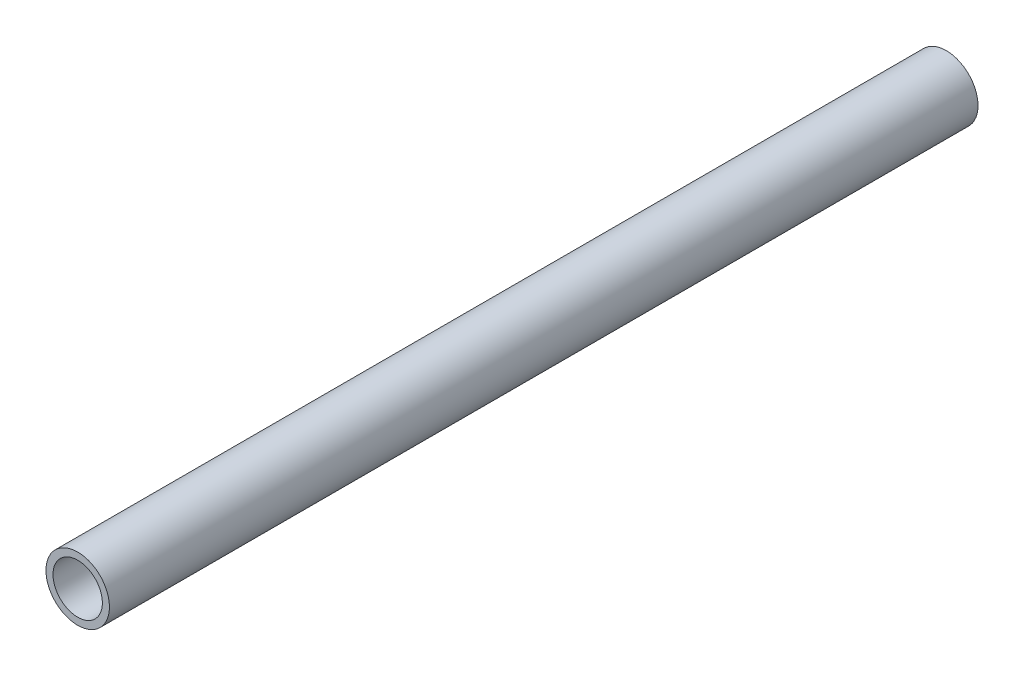
ISO-10303-21;
HEADER;
FILE_DESCRIPTION(('STEP AP214'),'2;1');
FILE_NAME('part.step','',(''),(''),'','','');
FILE_SCHEMA(('AUTOMOTIVE_DESIGN { 1 0 10303 214 1 1 1 1 }'));
ENDSEC;
DATA;
#1=APPLICATION_CONTEXT('core data for automotive mechanical design processes');
#2=APPLICATION_PROTOCOL_DEFINITION('international standard','automotive_design',2000,#1);
#3=PRODUCT_CONTEXT('',#1,'mechanical');
#4=PRODUCT('Part','Part','',(#3));
#5=PRODUCT_RELATED_PRODUCT_CATEGORY('part','',(#4));
#6=PRODUCT_DEFINITION_FORMATION('','',#4);
#7=PRODUCT_DEFINITION_CONTEXT('part definition',#1,'design');
#8=PRODUCT_DEFINITION('design','',#6,#7);
#9=PRODUCT_DEFINITION_SHAPE('','',#8);
#10=(LENGTH_UNIT() NAMED_UNIT(*) SI_UNIT(.MILLI.,.METRE.));
#11=(NAMED_UNIT(*) PLANE_ANGLE_UNIT() SI_UNIT($,.RADIAN.));
#12=(NAMED_UNIT(*) SI_UNIT($,.STERADIAN.) SOLID_ANGLE_UNIT());
#13=UNCERTAINTY_MEASURE_WITH_UNIT(LENGTH_MEASURE(1.E-05),#10,'distance_accuracy_value','');
#14=(GEOMETRIC_REPRESENTATION_CONTEXT(3) GLOBAL_UNCERTAINTY_ASSIGNED_CONTEXT((#13)) GLOBAL_UNIT_ASSIGNED_CONTEXT((#10,
#11,#12)) REPRESENTATION_CONTEXT('',''));
#15=CARTESIAN_POINT('',(0.,0.,0.));
#16=DIRECTION('',(0.,0.,1.));
#17=DIRECTION('',(1.,0.,0.));
#18=AXIS2_PLACEMENT_3D('',#15,#16,#17);
#19=CARTESIAN_POINT('',(0.,0.,246.188));
#20=DIRECTION('',(0.,0.,1.));
#21=DIRECTION('',(1.,0.,0.));
#22=AXIS2_PLACEMENT_3D('',#19,#20,#21);
#23=PLANE('',#22);
#24=CARTESIAN_POINT('',(0.,0.,246.188));
#25=DIRECTION('',(0.,0.,1.));
#26=DIRECTION('',(1.,0.,0.));
#27=AXIS2_PLACEMENT_3D('',#24,#25,#26);
#28=CIRCLE('',#27,9.);
#29=CARTESIAN_POINT('',(9.,0.,246.188));
#30=VERTEX_POINT('',#29);
#31=EDGE_CURVE('E10',#30,#30,#28,.T.);
#32=ORIENTED_EDGE('',*,*,#31,.T.);
#33=EDGE_LOOP('',(#32));
#34=FACE_BOUND('',#33,.T.);
#35=CARTESIAN_POINT('',(0.,0.,246.188));
#36=DIRECTION('',(0.,0.,1.));
#37=DIRECTION('',(1.,0.,0.));
#38=AXIS2_PLACEMENT_3D('',#35,#36,#37);
#39=CIRCLE('',#38,7.);
#40=CARTESIAN_POINT('',(7.,0.,246.188));
#41=VERTEX_POINT('',#40);
#42=EDGE_CURVE('E41',#41,#41,#39,.T.);
#43=ORIENTED_EDGE('',*,*,#42,.F.);
#44=EDGE_LOOP('',(#43));
#45=FACE_BOUND('',#44,.T.);
#46=ADVANCED_FACE('F30',(#34,#45),#23,.T.);
#47=CARTESIAN_POINT('',(0.,0.,0.));
#48=DIRECTION('',(0.,0.,1.));
#49=DIRECTION('',(1.,0.,0.));
#50=AXIS2_PLACEMENT_3D('',#47,#48,#49);
#51=PLANE('',#50);
#52=CARTESIAN_POINT('',(0.,0.,0.));
#53=DIRECTION('',(0.,0.,1.));
#54=DIRECTION('',(1.,0.,0.));
#55=AXIS2_PLACEMENT_3D('',#52,#53,#54);
#56=CIRCLE('',#55,9.);
#57=CARTESIAN_POINT('',(9.,0.,0.));
#58=VERTEX_POINT('',#57);
#59=EDGE_CURVE('E34',#58,#58,#56,.T.);
#60=ORIENTED_EDGE('',*,*,#59,.F.);
#61=EDGE_LOOP('',(#60));
#62=FACE_BOUND('',#61,.T.);
#63=CARTESIAN_POINT('',(0.,0.,0.));
#64=DIRECTION('',(0.,0.,1.));
#65=DIRECTION('',(1.,0.,0.));
#66=AXIS2_PLACEMENT_3D('',#63,#64,#65);
#67=CIRCLE('',#66,7.);
#68=CARTESIAN_POINT('',(7.,0.,0.));
#69=VERTEX_POINT('',#68);
#70=EDGE_CURVE('E43',#69,#69,#67,.T.);
#71=ORIENTED_EDGE('',*,*,#70,.T.);
#72=EDGE_LOOP('',(#71));
#73=FACE_BOUND('',#72,.T.);
#74=ADVANCED_FACE('F53',(#62,#73),#51,.F.);
#75=CARTESIAN_POINT('',(0.,0.,246.188));
#76=DIRECTION('',(0.,0.,-1.));
#77=DIRECTION('',(-1.,0.,0.));
#78=AXIS2_PLACEMENT_3D('',#75,#76,#77);
#79=CYLINDRICAL_SURFACE('',#78,9.);
#80=ORIENTED_EDGE('',*,*,#31,.F.);
#81=EDGE_LOOP('',(#80));
#82=FACE_BOUND('',#81,.T.);
#83=ORIENTED_EDGE('',*,*,#59,.T.);
#84=EDGE_LOOP('',(#83));
#85=FACE_BOUND('',#84,.T.);
#86=ADVANCED_FACE('F32',(#82,#85),#79,.T.);
#87=CARTESIAN_POINT('',(0.,0.,246.188));
#88=DIRECTION('',(0.,0.,-1.));
#89=DIRECTION('',(-1.,0.,0.));
#90=AXIS2_PLACEMENT_3D('',#87,#88,#89);
#91=CYLINDRICAL_SURFACE('',#90,7.);
#92=ORIENTED_EDGE('',*,*,#42,.T.);
#93=EDGE_LOOP('',(#92));
#94=FACE_BOUND('',#93,.T.);
#95=ORIENTED_EDGE('',*,*,#70,.F.);
#96=EDGE_LOOP('',(#95));
#97=FACE_BOUND('',#96,.T.);
#98=ADVANCED_FACE('F49',(#94,#97),#91,.F.);
#99=CLOSED_SHELL('',(#46,#74,#86,#98));
#100=MANIFOLD_SOLID_BREP('B2',#99);
#101=ADVANCED_BREP_SHAPE_REPRESENTATION('',(#18,#100),#14);
#102=SHAPE_DEFINITION_REPRESENTATION(#9,#101);
ENDSEC;
END-ISO-10303-21;
